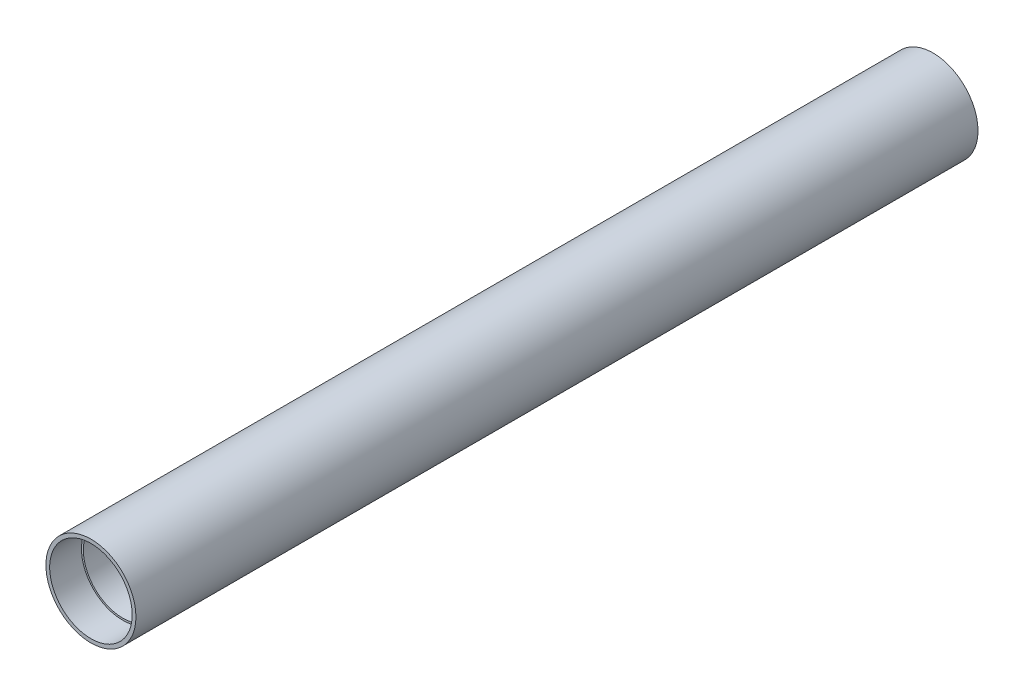
ISO-10303-21;
HEADER;
FILE_DESCRIPTION(('STEP AP214'),'2;1');
FILE_NAME('part.step','',(''),(''),'','','');
FILE_SCHEMA(('AUTOMOTIVE_DESIGN { 1 0 10303 214 1 1 1 1 }'));
ENDSEC;
DATA;
#1=APPLICATION_CONTEXT('core data for automotive mechanical design processes');
#2=APPLICATION_PROTOCOL_DEFINITION('international standard','automotive_design',2000,#1);
#3=PRODUCT_CONTEXT('',#1,'mechanical');
#4=PRODUCT('Part','Part','',(#3));
#5=PRODUCT_RELATED_PRODUCT_CATEGORY('part','',(#4));
#6=PRODUCT_DEFINITION_FORMATION('','',#4);
#7=PRODUCT_DEFINITION_CONTEXT('part definition',#1,'design');
#8=PRODUCT_DEFINITION('design','',#6,#7);
#9=PRODUCT_DEFINITION_SHAPE('','',#8);
#10=(LENGTH_UNIT() NAMED_UNIT(*) SI_UNIT(.MILLI.,.METRE.));
#11=(NAMED_UNIT(*) PLANE_ANGLE_UNIT() SI_UNIT($,.RADIAN.));
#12=(NAMED_UNIT(*) SI_UNIT($,.STERADIAN.) SOLID_ANGLE_UNIT());
#13=UNCERTAINTY_MEASURE_WITH_UNIT(LENGTH_MEASURE(1.E-05),#10,'distance_accuracy_value','');
#14=(GEOMETRIC_REPRESENTATION_CONTEXT(3) GLOBAL_UNCERTAINTY_ASSIGNED_CONTEXT((#13)) GLOBAL_UNIT_ASSIGNED_CONTEXT((#10,
#11,#12)) REPRESENTATION_CONTEXT('',''));
#15=CARTESIAN_POINT('',(0.,0.,0.));
#16=DIRECTION('',(0.,0.,1.));
#17=DIRECTION('',(1.,0.,0.));
#18=AXIS2_PLACEMENT_3D('',#15,#16,#17);
#19=CARTESIAN_POINT('',(0.,0.,356.362));
#20=DIRECTION('',(0.,0.,-1.));
#21=DIRECTION('',(-1.,0.,0.));
#22=AXIS2_PLACEMENT_3D('',#19,#20,#21);
#23=CYLINDRICAL_SURFACE('',#22,16.6751);
#24=CARTESIAN_POINT('',(0.,0.,342.9));
#25=DIRECTION('',(0.,0.,1.));
#26=DIRECTION('',(1.,0.,0.));
#27=AXIS2_PLACEMENT_3D('',#24,#25,#26);
#28=CIRCLE('',#27,16.6751);
#29=CARTESIAN_POINT('',(16.6751,0.,342.9));
#30=VERTEX_POINT('',#29);
#31=EDGE_CURVE('E54',#30,#30,#28,.T.);
#32=ORIENTED_EDGE('',*,*,#31,.T.);
#33=EDGE_LOOP('',(#32));
#34=FACE_BOUND('',#33,.T.);
#35=CARTESIAN_POINT('',(0.,0.,13.462));
#36=DIRECTION('',(0.,0.,-1.));
#37=DIRECTION('',(-1.,0.,0.));
#38=AXIS2_PLACEMENT_3D('',#35,#36,#37);
#39=CIRCLE('',#38,16.6751);
#40=CARTESIAN_POINT('',(-16.6751,0.,13.462));
#41=VERTEX_POINT('',#40);
#42=EDGE_CURVE('E45',#41,#41,#39,.T.);
#43=ORIENTED_EDGE('',*,*,#42,.T.);
#44=EDGE_LOOP('',(#43));
#45=FACE_BOUND('',#44,.T.);
#46=ADVANCED_FACE('F41',(#34,#45),#23,.F.);
#47=CARTESIAN_POINT('',(0.,0.,356.362));
#48=DIRECTION('',(0.,0.,1.));
#49=DIRECTION('',(1.,0.,0.));
#50=AXIS2_PLACEMENT_3D('',#47,#48,#49);
#51=PLANE('',#50);
#52=CARTESIAN_POINT('',(0.,0.,356.362));
#53=DIRECTION('',(0.,0.,1.));
#54=DIRECTION('',(1.,0.,0.));
#55=AXIS2_PLACEMENT_3D('',#52,#53,#54);
#56=CIRCLE('',#55,17.4625);
#57=CARTESIAN_POINT('',(17.4625,0.,356.362));
#58=VERTEX_POINT('',#57);
#59=EDGE_CURVE('E57',#58,#58,#56,.T.);
#60=ORIENTED_EDGE('',*,*,#59,.F.);
#61=EDGE_LOOP('',(#60));
#62=FACE_BOUND('',#61,.T.);
#63=CARTESIAN_POINT('',(0.,0.,356.362));
#64=DIRECTION('',(0.,0.,1.));
#65=DIRECTION('',(1.,0.,0.));
#66=AXIS2_PLACEMENT_3D('',#63,#64,#65);
#67=CIRCLE('',#66,19.05);
#68=CARTESIAN_POINT('',(19.05,0.,356.362));
#69=VERTEX_POINT('',#68);
#70=EDGE_CURVE('E10',#69,#69,#67,.T.);
#71=ORIENTED_EDGE('',*,*,#70,.T.);
#72=EDGE_LOOP('',(#71));
#73=FACE_BOUND('',#72,.T.);
#74=ADVANCED_FACE('F90',(#62,#73),#51,.T.);
#75=CARTESIAN_POINT('',(0.,0.,0.));
#76=DIRECTION('',(0.,0.,1.));
#77=DIRECTION('',(1.,0.,0.));
#78=AXIS2_PLACEMENT_3D('',#75,#76,#77);
#79=PLANE('',#78);
#80=CARTESIAN_POINT('',(0.,0.,0.));
#81=DIRECTION('',(0.,0.,-1.));
#82=DIRECTION('',(-1.,0.,0.));
#83=AXIS2_PLACEMENT_3D('',#80,#81,#82);
#84=CIRCLE('',#83,17.4625);
#85=CARTESIAN_POINT('',(-17.4625,0.,0.));
#86=VERTEX_POINT('',#85);
#87=EDGE_CURVE('E68',#86,#86,#84,.T.);
#88=ORIENTED_EDGE('',*,*,#87,.F.);
#89=EDGE_LOOP('',(#88));
#90=FACE_BOUND('',#89,.T.);
#91=CARTESIAN_POINT('',(0.,0.,0.));
#92=DIRECTION('',(0.,0.,1.));
#93=DIRECTION('',(1.,0.,0.));
#94=AXIS2_PLACEMENT_3D('',#91,#92,#93);
#95=CIRCLE('',#94,19.05);
#96=CARTESIAN_POINT('',(19.05,0.,0.));
#97=VERTEX_POINT('',#96);
#98=EDGE_CURVE('E49',#97,#97,#95,.T.);
#99=ORIENTED_EDGE('',*,*,#98,.F.);
#100=EDGE_LOOP('',(#99));
#101=FACE_BOUND('',#100,.T.);
#102=ADVANCED_FACE('F95',(#90,#101),#79,.F.);
#103=CARTESIAN_POINT('',(0.,0.,356.362));
#104=DIRECTION('',(0.,0.,-1.));
#105=DIRECTION('',(-1.,0.,0.));
#106=AXIS2_PLACEMENT_3D('',#103,#104,#105);
#107=CYLINDRICAL_SURFACE('',#106,19.05);
#108=ORIENTED_EDGE('',*,*,#70,.F.);
#109=EDGE_LOOP('',(#108));
#110=FACE_BOUND('',#109,.T.);
#111=ORIENTED_EDGE('',*,*,#98,.T.);
#112=EDGE_LOOP('',(#111));
#113=FACE_BOUND('',#112,.T.);
#114=ADVANCED_FACE('F43',(#110,#113),#107,.T.);
#115=CARTESIAN_POINT('',(0.,0.,342.9));
#116=DIRECTION('',(0.,0.,1.));
#117=DIRECTION('',(1.,0.,0.));
#118=AXIS2_PLACEMENT_3D('',#115,#116,#117);
#119=CYLINDRICAL_SURFACE('',#118,17.4625);
#120=CARTESIAN_POINT('',(0.,0.,342.9));
#121=DIRECTION('',(0.,0.,1.));
#122=DIRECTION('',(1.,0.,0.));
#123=AXIS2_PLACEMENT_3D('',#120,#121,#122);
#124=CIRCLE('',#123,17.4625);
#125=CARTESIAN_POINT('',(17.4625,0.,342.9));
#126=VERTEX_POINT('',#125);
#127=EDGE_CURVE('E60',#126,#126,#124,.T.);
#128=ORIENTED_EDGE('',*,*,#127,.F.);
#129=EDGE_LOOP('',(#128));
#130=FACE_BOUND('',#129,.T.);
#131=ORIENTED_EDGE('',*,*,#59,.T.);
#132=EDGE_LOOP('',(#131));
#133=FACE_BOUND('',#132,.T.);
#134=ADVANCED_FACE('F99',(#130,#133),#119,.F.);
#135=CARTESIAN_POINT('',(0.,0.,342.9));
#136=DIRECTION('',(0.,0.,1.));
#137=DIRECTION('',(1.,0.,0.));
#138=AXIS2_PLACEMENT_3D('',#135,#136,#137);
#139=PLANE('',#138);
#140=ORIENTED_EDGE('',*,*,#31,.F.);
#141=EDGE_LOOP('',(#140));
#142=FACE_BOUND('',#141,.T.);
#143=ORIENTED_EDGE('',*,*,#127,.T.);
#144=EDGE_LOOP('',(#143));
#145=FACE_BOUND('',#144,.T.);
#146=ADVANCED_FACE('F86',(#142,#145),#139,.T.);
#147=CARTESIAN_POINT('',(0.,0.,13.462));
#148=DIRECTION('',(0.,0.,-1.));
#149=DIRECTION('',(-1.,0.,0.));
#150=AXIS2_PLACEMENT_3D('',#147,#148,#149);
#151=CYLINDRICAL_SURFACE('',#150,17.4625);
#152=CARTESIAN_POINT('',(0.,0.,13.462));
#153=DIRECTION('',(0.,0.,-1.));
#154=DIRECTION('',(-1.,0.,0.));
#155=AXIS2_PLACEMENT_3D('',#152,#153,#154);
#156=CIRCLE('',#155,17.4625);
#157=CARTESIAN_POINT('',(-17.4625,0.,13.462));
#158=VERTEX_POINT('',#157);
#159=EDGE_CURVE('E71',#158,#158,#156,.T.);
#160=ORIENTED_EDGE('',*,*,#159,.F.);
#161=EDGE_LOOP('',(#160));
#162=FACE_BOUND('',#161,.T.);
#163=ORIENTED_EDGE('',*,*,#87,.T.);
#164=EDGE_LOOP('',(#163));
#165=FACE_BOUND('',#164,.T.);
#166=ADVANCED_FACE('F81',(#162,#165),#151,.F.);
#167=CARTESIAN_POINT('',(0.,0.,13.462));
#168=DIRECTION('',(0.,0.,-1.));
#169=DIRECTION('',(-1.,0.,0.));
#170=AXIS2_PLACEMENT_3D('',#167,#168,#169);
#171=PLANE('',#170);
#172=ORIENTED_EDGE('',*,*,#42,.F.);
#173=EDGE_LOOP('',(#172));
#174=FACE_BOUND('',#173,.T.);
#175=ORIENTED_EDGE('',*,*,#159,.T.);
#176=EDGE_LOOP('',(#175));
#177=FACE_BOUND('',#176,.T.);
#178=ADVANCED_FACE('F79',(#174,#177),#171,.T.);
#179=CLOSED_SHELL('',(#46,#74,#102,#114,#134,#146,#166,#178));
#180=MANIFOLD_SOLID_BREP('B2',#179);
#181=ADVANCED_BREP_SHAPE_REPRESENTATION('',(#18,#180),#14);
#182=SHAPE_DEFINITION_REPRESENTATION(#9,#181);
ENDSEC;
END-ISO-10303-21;
